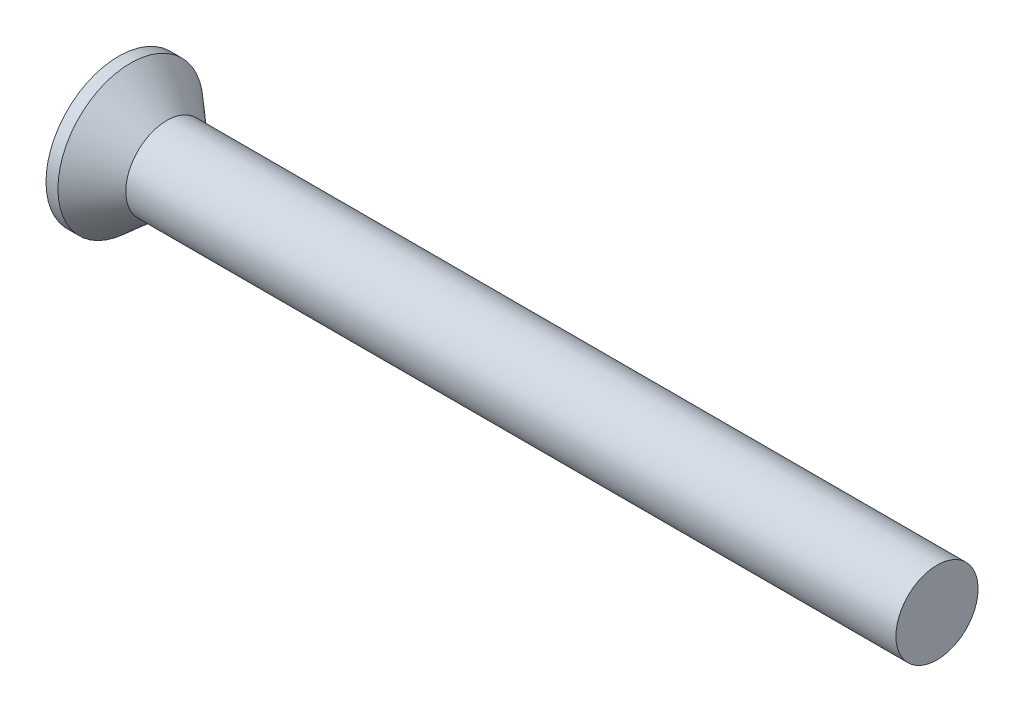
ISO-10303-21;
HEADER;
FILE_DESCRIPTION(('STEP AP214'),'2;1');
FILE_NAME('part.step','',(''),(''),'','','');
FILE_SCHEMA(('AUTOMOTIVE_DESIGN { 1 0 10303 214 1 1 1 1 }'));
ENDSEC;
DATA;
#1=APPLICATION_CONTEXT('core data for automotive mechanical design processes');
#2=APPLICATION_PROTOCOL_DEFINITION('international standard','automotive_design',2000,#1);
#3=PRODUCT_CONTEXT('',#1,'mechanical');
#4=PRODUCT('Part','Part','',(#3));
#5=PRODUCT_RELATED_PRODUCT_CATEGORY('part','',(#4));
#6=PRODUCT_DEFINITION_FORMATION('','',#4);
#7=PRODUCT_DEFINITION_CONTEXT('part definition',#1,'design');
#8=PRODUCT_DEFINITION('design','',#6,#7);
#9=PRODUCT_DEFINITION_SHAPE('','',#8);
#10=(LENGTH_UNIT() NAMED_UNIT(*) SI_UNIT(.MILLI.,.METRE.));
#11=(NAMED_UNIT(*) PLANE_ANGLE_UNIT() SI_UNIT($,.RADIAN.));
#12=(NAMED_UNIT(*) SI_UNIT($,.STERADIAN.) SOLID_ANGLE_UNIT());
#13=UNCERTAINTY_MEASURE_WITH_UNIT(LENGTH_MEASURE(1.E-05),#10,'distance_accuracy_value','');
#14=(GEOMETRIC_REPRESENTATION_CONTEXT(3) GLOBAL_UNCERTAINTY_ASSIGNED_CONTEXT((#13)) GLOBAL_UNIT_ASSIGNED_CONTEXT((#10,
#11,#12)) REPRESENTATION_CONTEXT('',''));
#15=CARTESIAN_POINT('',(0.,0.,0.));
#16=DIRECTION('',(0.,0.,1.));
#17=DIRECTION('',(1.,0.,0.));
#18=AXIS2_PLACEMENT_3D('',#15,#16,#17);
#19=CARTESIAN_POINT('',(0.,0.,0.));
#20=DIRECTION('',(-1.,0.,0.));
#21=DIRECTION('',(0.,0.,1.));
#22=AXIS2_PLACEMENT_3D('',#19,#20,#21);
#23=PLANE('',#22);
#24=CARTESIAN_POINT('',(0.,0.,0.));
#25=DIRECTION('',(-1.,0.,0.));
#26=DIRECTION('',(0.,0.,1.));
#27=AXIS2_PLACEMENT_3D('',#24,#25,#26);
#28=CIRCLE('',#27,3.0988);
#29=CARTESIAN_POINT('',(0.,0.,3.0988));
#30=VERTEX_POINT('',#29);
#31=EDGE_CURVE('E40',#30,#30,#28,.T.);
#32=ORIENTED_EDGE('',*,*,#31,.T.);
#33=EDGE_LOOP('',(#32));
#34=FACE_BOUND('',#33,.T.);
#35=DIRECTION('',(0.,1.,0.));
#36=VECTOR('',#35,1.);
#37=CARTESIAN_POINT('',(0.,-2.4765,-0.4826));
#38=LINE('',#37,#36);
#39=CARTESIAN_POINT('',(0.,-2.4765,-0.4826));
#40=VERTEX_POINT('',#39);
#41=CARTESIAN_POINT('',(0.,-0.482599999999998,-0.4826));
#42=VERTEX_POINT('',#41);
#43=EDGE_CURVE('E101',#40,#42,#38,.T.);
#44=ORIENTED_EDGE('',*,*,#43,.T.);
#45=DIRECTION('',(0.,0.,-1.));
#46=VECTOR('',#45,1.);
#47=CARTESIAN_POINT('',(0.,-0.482600000000008,2.4765));
#48=LINE('',#47,#46);
#49=CARTESIAN_POINT('',(0.,-0.482599999999992,-2.4765));
#50=VERTEX_POINT('',#49);
#51=EDGE_CURVE('E81',#42,#50,#48,.T.);
#52=ORIENTED_EDGE('',*,*,#51,.T.);
#53=DIRECTION('',(0.,1.,0.));
#54=VECTOR('',#53,1.);
#55=CARTESIAN_POINT('',(0.,-0.482599999999992,-2.4765));
#56=LINE('',#55,#54);
#57=CARTESIAN_POINT('',(0.,0.482600000000008,-2.4765));
#58=VERTEX_POINT('',#57);
#59=EDGE_CURVE('E336',#50,#58,#56,.T.);
#60=ORIENTED_EDGE('',*,*,#59,.T.);
#61=DIRECTION('',(0.,0.,1.));
#62=VECTOR('',#61,1.);
#63=CARTESIAN_POINT('',(0.,0.482600000000008,-2.4765));
#64=LINE('',#63,#62);
#65=CARTESIAN_POINT('',(0.,0.482600000000001,-0.4826));
#66=VERTEX_POINT('',#65);
#67=EDGE_CURVE('E97',#58,#66,#64,.T.);
#68=ORIENTED_EDGE('',*,*,#67,.T.);
#69=CARTESIAN_POINT('',(0.,2.4765,-0.4826));
#70=VERTEX_POINT('',#69);
#71=EDGE_CURVE('E91',#66,#70,#38,.T.);
#72=ORIENTED_EDGE('',*,*,#71,.T.);
#73=DIRECTION('',(0.,0.,1.));
#74=VECTOR('',#73,1.);
#75=CARTESIAN_POINT('',(0.,2.4765,-0.4826));
#76=LINE('',#75,#74);
#77=CARTESIAN_POINT('',(0.,2.4765,0.4826));
#78=VERTEX_POINT('',#77);
#79=EDGE_CURVE('E94',#70,#78,#76,.T.);
#80=ORIENTED_EDGE('',*,*,#79,.T.);
#81=DIRECTION('',(0.,-1.,0.));
#82=VECTOR('',#81,1.);
#83=CARTESIAN_POINT('',(0.,2.4765,0.4826));
#84=LINE('',#83,#82);
#85=CARTESIAN_POINT('',(0.,0.482599999999998,0.4826));
#86=VERTEX_POINT('',#85);
#87=EDGE_CURVE('E348',#78,#86,#84,.T.);
#88=ORIENTED_EDGE('',*,*,#87,.T.);
#89=CARTESIAN_POINT('',(0.,0.482599999999991,2.4765));
#90=VERTEX_POINT('',#89);
#91=EDGE_CURVE('E331',#86,#90,#64,.T.);
#92=ORIENTED_EDGE('',*,*,#91,.T.);
#93=DIRECTION('',(0.,-1.,0.));
#94=VECTOR('',#93,1.);
#95=CARTESIAN_POINT('',(0.,0.482599999999991,2.4765));
#96=LINE('',#95,#94);
#97=CARTESIAN_POINT('',(0.,-0.482600000000008,2.4765));
#98=VERTEX_POINT('',#97);
#99=EDGE_CURVE('E317',#90,#98,#96,.T.);
#100=ORIENTED_EDGE('',*,*,#99,.T.);
#101=CARTESIAN_POINT('',(0.,-0.482600000000002,0.4826));
#102=VERTEX_POINT('',#101);
#103=EDGE_CURVE('E329',#98,#102,#48,.T.);
#104=ORIENTED_EDGE('',*,*,#103,.T.);
#105=CARTESIAN_POINT('',(0.,-2.4765,0.4826));
#106=VERTEX_POINT('',#105);
#107=EDGE_CURVE('E107',#102,#106,#84,.T.);
#108=ORIENTED_EDGE('',*,*,#107,.T.);
#109=DIRECTION('',(0.,0.,-1.));
#110=VECTOR('',#109,1.);
#111=CARTESIAN_POINT('',(0.,-2.4765,0.4826));
#112=LINE('',#111,#110);
#113=EDGE_CURVE('E130',#106,#40,#112,.T.);
#114=ORIENTED_EDGE('',*,*,#113,.T.);
#115=EDGE_LOOP('',(#44,#52,#60,#68,#72,#80,#88,#92,#100,#104,#108,#114));
#116=FACE_BOUND('',#115,.T.);
#117=ADVANCED_FACE('F33',(#34,#116),#23,.T.);
#118=CARTESIAN_POINT('',(3.18005113636364,0.,0.215250568181818));
#119=DIRECTION('',(-0.0837752602144701,0.,-0.996484674130013));
#120=DIRECTION('',(-0.996484674130013,0.,0.0837752602144701));
#121=AXIS2_PLACEMENT_3D('',#118,#119,#120);
#122=PLANE('',#121);
#123=ORIENTED_EDGE('',*,*,#107,.F.);
#124=DIRECTION('',(0.993006162058238,0.0834828189341,-0.0834828189340997));
#125=VECTOR('',#124,1.);
#126=CARTESIAN_POINT('',(3.19789518323365,-0.213750404949385,0.213750404949384));
#127=LINE('',#126,#125);
#128=CARTESIAN_POINT('',(2.8702,-0.241300000000001,0.241299999999999));
#129=VERTEX_POINT('',#128);
#130=EDGE_CURVE('E125',#102,#129,#127,.T.);
#131=ORIENTED_EDGE('',*,*,#130,.T.);
#132=DIRECTION('',(0.78724620786628,0.613076692851616,-0.0661844157055722));
#133=VECTOR('',#132,1.);
#134=CARTESIAN_POINT('',(0.,-2.4765,0.4826));
#135=LINE('',#134,#133);
#136=EDGE_CURVE('E102',#106,#129,#135,.T.);
#137=ORIENTED_EDGE('',*,*,#136,.F.);
#138=EDGE_LOOP('',(#123,#131,#137));
#139=FACE_BOUND('',#138,.T.);
#140=ADVANCED_FACE('F153',(#139),#122,.T.);
#141=DIRECTION('',(0.78724620786628,-0.613076692851616,-0.0661844157055721));
#142=VECTOR('',#141,1.);
#143=CARTESIAN_POINT('',(0.,2.4765,0.4826));
#144=LINE('',#143,#142);
#145=CARTESIAN_POINT('',(2.8702,0.2413,0.2413));
#146=VERTEX_POINT('',#145);
#147=EDGE_CURVE('E47',#78,#146,#144,.T.);
#148=ORIENTED_EDGE('',*,*,#147,.T.);
#149=DIRECTION('',(-0.993006162058239,0.0834828189340993,0.0834828189340997));
#150=VECTOR('',#149,1.);
#151=CARTESIAN_POINT('',(3.19789518323365,0.213750404949383,0.213750404949384));
#152=LINE('',#151,#150);
#153=EDGE_CURVE('E344',#146,#86,#152,.T.);
#154=ORIENTED_EDGE('',*,*,#153,.T.);
#155=ORIENTED_EDGE('',*,*,#87,.F.);
#156=EDGE_LOOP('',(#148,#154,#155));
#157=FACE_BOUND('',#156,.T.);
#158=ADVANCED_FACE('F157',(#157),#122,.T.);
#159=CARTESIAN_POINT('',(3.18005113636364,0.,-0.215250568181818));
#160=DIRECTION('',(-0.08377526021447,0.,0.996484674130013));
#161=DIRECTION('',(0.996484674130013,0.,0.08377526021447));
#162=AXIS2_PLACEMENT_3D('',#159,#160,#161);
#163=PLANE('',#162);
#164=DIRECTION('',(0.78724620786628,0.613076692851616,0.0661844157055721));
#165=VECTOR('',#164,1.);
#166=CARTESIAN_POINT('',(0.,-2.4765,-0.4826));
#167=LINE('',#166,#165);
#168=CARTESIAN_POINT('',(2.8702,-0.241299999999999,-0.241300000000001));
#169=VERTEX_POINT('',#168);
#170=EDGE_CURVE('E56',#40,#169,#167,.T.);
#171=ORIENTED_EDGE('',*,*,#170,.T.);
#172=DIRECTION('',(-0.993006162058239,-0.0834828189340994,-0.0834828189340996));
#173=VECTOR('',#172,1.);
#174=CARTESIAN_POINT('',(3.19789518323364,-0.213750404949383,-0.213750404949384));
#175=LINE('',#174,#173);
#176=EDGE_CURVE('E11',#169,#42,#175,.T.);
#177=ORIENTED_EDGE('',*,*,#176,.T.);
#178=ORIENTED_EDGE('',*,*,#43,.F.);
#179=EDGE_LOOP('',(#171,#177,#178));
#180=FACE_BOUND('',#179,.T.);
#181=ADVANCED_FACE('F150',(#180),#163,.T.);
#182=ORIENTED_EDGE('',*,*,#71,.F.);
#183=DIRECTION('',(0.993006162058238,-0.0834828189340999,0.0834828189340996));
#184=VECTOR('',#183,1.);
#185=CARTESIAN_POINT('',(3.19789518323364,0.213750404949385,-0.213750404949384));
#186=LINE('',#185,#184);
#187=CARTESIAN_POINT('',(2.8702,0.2413,-0.2413));
#188=VERTEX_POINT('',#187);
#189=EDGE_CURVE('E110',#66,#188,#186,.T.);
#190=ORIENTED_EDGE('',*,*,#189,.T.);
#191=DIRECTION('',(0.78724620786628,-0.613076692851616,0.0661844157055721));
#192=VECTOR('',#191,1.);
#193=CARTESIAN_POINT('',(0.,2.4765,-0.4826));
#194=LINE('',#193,#192);
#195=EDGE_CURVE('E106',#70,#188,#194,.T.);
#196=ORIENTED_EDGE('',*,*,#195,.F.);
#197=EDGE_LOOP('',(#182,#190,#196));
#198=FACE_BOUND('',#197,.T.);
#199=ADVANCED_FACE('F109',(#198),#163,.T.);
#200=CARTESIAN_POINT('',(-6.34999999999999,0.,0.));
#201=DIRECTION('',(-1.,0.,0.));
#202=DIRECTION('',(0.,0.,1.));
#203=AXIS2_PLACEMENT_3D('',#200,#201,#202);
#204=CYLINDRICAL_SURFACE('',#203,3.0988);
#205=CARTESIAN_POINT('',(0.508774050199084,0.,0.));
#206=DIRECTION('',(-1.,0.,0.));
#207=DIRECTION('',(0.,0.,1.));
#208=AXIS2_PLACEMENT_3D('',#205,#206,#207);
#209=CIRCLE('',#208,3.0988);
#210=CARTESIAN_POINT('',(0.508774050199084,0.,3.0988));
#211=VERTEX_POINT('',#210);
#212=EDGE_CURVE('E133',#211,#211,#209,.T.);
#213=ORIENTED_EDGE('',*,*,#212,.T.);
#214=EDGE_LOOP('',(#213));
#215=FACE_BOUND('',#214,.T.);
#216=ORIENTED_EDGE('',*,*,#31,.F.);
#217=EDGE_LOOP('',(#216));
#218=FACE_BOUND('',#217,.T.);
#219=ADVANCED_FACE('F139',(#215,#218),#204,.T.);
#220=CARTESIAN_POINT('',(0.508774050199084,0.,0.));
#221=DIRECTION('',(-1.,0.,0.));
#222=DIRECTION('',(0.,0.,1.));
#223=AXIS2_PLACEMENT_3D('',#220,#221,#222);
#224=CONICAL_SURFACE('',#223,3.0988,0.715584993317677);
#225=CARTESIAN_POINT('',(2.0574,0.,0.));
#226=DIRECTION('',(-1.,0.,0.));
#227=DIRECTION('',(0.,0.,1.));
#228=AXIS2_PLACEMENT_3D('',#225,#226,#227);
#229=CIRCLE('',#228,1.7526);
#230=CARTESIAN_POINT('',(2.0574,0.,1.7526));
#231=VERTEX_POINT('',#230);
#232=EDGE_CURVE('E129',#231,#231,#229,.T.);
#233=ORIENTED_EDGE('',*,*,#232,.T.);
#234=EDGE_LOOP('',(#233));
#235=FACE_BOUND('',#234,.T.);
#236=ORIENTED_EDGE('',*,*,#212,.F.);
#237=EDGE_LOOP('',(#236));
#238=FACE_BOUND('',#237,.T.);
#239=ADVANCED_FACE('F141',(#235,#238),#224,.T.);
#240=CARTESIAN_POINT('',(-6.34999999999999,0.,0.));
#241=DIRECTION('',(-1.,0.,0.));
#242=DIRECTION('',(0.,0.,1.));
#243=AXIS2_PLACEMENT_3D('',#240,#241,#242);
#244=CYLINDRICAL_SURFACE('',#243,1.7526);
#245=CARTESIAN_POINT('',(34.925,0.,0.));
#246=DIRECTION('',(-1.,0.,0.));
#247=DIRECTION('',(0.,0.,1.));
#248=AXIS2_PLACEMENT_3D('',#245,#246,#247);
#249=CIRCLE('',#248,1.7526);
#250=CARTESIAN_POINT('',(34.925,0.,1.7526));
#251=VERTEX_POINT('',#250);
#252=EDGE_CURVE('E126',#251,#251,#249,.T.);
#253=ORIENTED_EDGE('',*,*,#252,.T.);
#254=EDGE_LOOP('',(#253));
#255=FACE_BOUND('',#254,.T.);
#256=ORIENTED_EDGE('',*,*,#232,.F.);
#257=EDGE_LOOP('',(#256));
#258=FACE_BOUND('',#257,.T.);
#259=ADVANCED_FACE('F147',(#255,#258),#244,.T.);
#260=CARTESIAN_POINT('',(34.925,1.7526,0.));
#261=DIRECTION('',(1.,0.,0.));
#262=DIRECTION('',(0.,0.,-1.));
#263=AXIS2_PLACEMENT_3D('',#260,#261,#262);
#264=PLANE('',#263);
#265=ORIENTED_EDGE('',*,*,#252,.F.);
#266=EDGE_LOOP('',(#265));
#267=FACE_BOUND('',#266,.T.);
#268=ADVANCED_FACE('F177',(#267),#264,.T.);
#269=CARTESIAN_POINT('',(2.8702,0.2413,-0.2413));
#270=DIRECTION('',(1.,0.,0.));
#271=DIRECTION('',(0.,0.,-1.));
#272=AXIS2_PLACEMENT_3D('',#269,#270,#271);
#273=PLANE('',#272);
#274=DIRECTION('',(0.,1.,0.));
#275=VECTOR('',#274,1.);
#276=CARTESIAN_POINT('',(2.8702,-0.2413,-0.2413));
#277=LINE('',#276,#275);
#278=EDGE_CURVE('E121',#169,#188,#277,.T.);
#279=ORIENTED_EDGE('',*,*,#278,.F.);
#280=DIRECTION('',(0.,0.,-1.));
#281=VECTOR('',#280,1.);
#282=CARTESIAN_POINT('',(2.8702,-0.2413,0.2413));
#283=LINE('',#282,#281);
#284=EDGE_CURVE('E112',#129,#169,#283,.T.);
#285=ORIENTED_EDGE('',*,*,#284,.F.);
#286=DIRECTION('',(0.,-1.,0.));
#287=VECTOR('',#286,1.);
#288=CARTESIAN_POINT('',(2.8702,0.2413,0.2413));
#289=LINE('',#288,#287);
#290=EDGE_CURVE('E115',#146,#129,#289,.T.);
#291=ORIENTED_EDGE('',*,*,#290,.F.);
#292=DIRECTION('',(0.,0.,1.));
#293=VECTOR('',#292,1.);
#294=CARTESIAN_POINT('',(2.8702,0.2413,-0.2413));
#295=LINE('',#294,#293);
#296=EDGE_CURVE('E119',#188,#146,#295,.T.);
#297=ORIENTED_EDGE('',*,*,#296,.F.);
#298=EDGE_LOOP('',(#279,#285,#291,#297));
#299=FACE_BOUND('',#298,.T.);
#300=ADVANCED_FACE('F174',(#299),#273,.F.);
#301=CARTESIAN_POINT('',(0.,-2.4765,-0.4826));
#302=DIRECTION('',(-0.614423873827266,0.788976110710012,0.));
#303=DIRECTION('',(-0.788976110710012,-0.614423873827266,0.));
#304=AXIS2_PLACEMENT_3D('',#301,#302,#303);
#305=PLANE('',#304);
#306=ORIENTED_EDGE('',*,*,#170,.F.);
#307=ORIENTED_EDGE('',*,*,#113,.F.);
#308=ORIENTED_EDGE('',*,*,#136,.T.);
#309=ORIENTED_EDGE('',*,*,#284,.T.);
#310=EDGE_LOOP('',(#306,#307,#308,#309));
#311=FACE_BOUND('',#310,.T.);
#312=ADVANCED_FACE('F166',(#311),#305,.T.);
#313=CARTESIAN_POINT('',(2.8702,0.2413,0.2413));
#314=DIRECTION('',(-0.614423873827266,-0.788976110710012,0.));
#315=DIRECTION('',(0.788976110710012,-0.614423873827266,0.));
#316=AXIS2_PLACEMENT_3D('',#313,#314,#315);
#317=PLANE('',#316);
#318=ORIENTED_EDGE('',*,*,#147,.F.);
#319=ORIENTED_EDGE('',*,*,#79,.F.);
#320=ORIENTED_EDGE('',*,*,#195,.T.);
#321=ORIENTED_EDGE('',*,*,#296,.T.);
#322=EDGE_LOOP('',(#318,#319,#320,#321));
#323=FACE_BOUND('',#322,.T.);
#324=ADVANCED_FACE('F105',(#323),#317,.T.);
#325=CARTESIAN_POINT('',(3.18005113636364,-0.215250568181818,0.));
#326=DIRECTION('',(-0.0837752602144701,0.996484674130013,0.));
#327=DIRECTION('',(-0.996484674130013,-0.0837752602144701,0.));
#328=AXIS2_PLACEMENT_3D('',#325,#326,#327);
#329=PLANE('',#328);
#330=DIRECTION('',(0.78724620786628,0.0661844157055701,0.613076692851616));
#331=VECTOR('',#330,1.);
#332=CARTESIAN_POINT('',(0.,-0.482599999999992,-2.4765));
#333=LINE('',#332,#331);
#334=EDGE_CURVE('E338',#50,#169,#333,.T.);
#335=ORIENTED_EDGE('',*,*,#334,.F.);
#336=ORIENTED_EDGE('',*,*,#51,.F.);
#337=ORIENTED_EDGE('',*,*,#176,.F.);
#338=EDGE_LOOP('',(#335,#336,#337));
#339=FACE_BOUND('',#338,.T.);
#340=ADVANCED_FACE('F173',(#339),#329,.T.);
#341=CARTESIAN_POINT('',(3.18005113636364,0.215250568181818,0.));
#342=DIRECTION('',(-0.08377526021447,-0.996484674130013,0.));
#343=DIRECTION('',(0.996484674130013,-0.08377526021447,0.));
#344=AXIS2_PLACEMENT_3D('',#341,#342,#343);
#345=PLANE('',#344);
#346=ORIENTED_EDGE('',*,*,#67,.F.);
#347=DIRECTION('',(0.78724620786628,-0.0661844157055742,0.613076692851616));
#348=VECTOR('',#347,1.);
#349=CARTESIAN_POINT('',(0.,0.482600000000008,-2.4765));
#350=LINE('',#349,#348);
#351=EDGE_CURVE('E72',#58,#188,#350,.T.);
#352=ORIENTED_EDGE('',*,*,#351,.T.);
#353=ORIENTED_EDGE('',*,*,#189,.F.);
#354=EDGE_LOOP('',(#346,#352,#353));
#355=FACE_BOUND('',#354,.T.);
#356=ADVANCED_FACE('F217',(#355),#345,.T.);
#357=CARTESIAN_POINT('',(0.,0.482600000000008,-2.4765));
#358=DIRECTION('',(-0.614423873827266,0.,0.788976110710012));
#359=DIRECTION('',(-0.788976110710012,0.,-0.614423873827266));
#360=AXIS2_PLACEMENT_3D('',#357,#358,#359);
#361=PLANE('',#360);
#362=ORIENTED_EDGE('',*,*,#351,.F.);
#363=ORIENTED_EDGE('',*,*,#59,.F.);
#364=ORIENTED_EDGE('',*,*,#334,.T.);
#365=ORIENTED_EDGE('',*,*,#278,.T.);
#366=EDGE_LOOP('',(#362,#363,#364,#365));
#367=FACE_BOUND('',#366,.T.);
#368=ADVANCED_FACE('F225',(#367),#361,.T.);
#369=ORIENTED_EDGE('',*,*,#103,.F.);
#370=DIRECTION('',(0.78724620786628,0.0661844157055742,-0.613076692851616));
#371=VECTOR('',#370,1.);
#372=CARTESIAN_POINT('',(0.,-0.482600000000008,2.4765));
#373=LINE('',#372,#371);
#374=EDGE_CURVE('E314',#98,#129,#373,.T.);
#375=ORIENTED_EDGE('',*,*,#374,.T.);
#376=ORIENTED_EDGE('',*,*,#130,.F.);
#377=EDGE_LOOP('',(#369,#375,#376));
#378=FACE_BOUND('',#377,.T.);
#379=ADVANCED_FACE('F219',(#378),#329,.T.);
#380=DIRECTION('',(0.78724620786628,-0.06618441570557,-0.613076692851616));
#381=VECTOR('',#380,1.);
#382=CARTESIAN_POINT('',(0.,0.482599999999991,2.4765));
#383=LINE('',#382,#381);
#384=EDGE_CURVE('E325',#90,#146,#383,.T.);
#385=ORIENTED_EDGE('',*,*,#384,.F.);
#386=ORIENTED_EDGE('',*,*,#91,.F.);
#387=ORIENTED_EDGE('',*,*,#153,.F.);
#388=EDGE_LOOP('',(#385,#386,#387));
#389=FACE_BOUND('',#388,.T.);
#390=ADVANCED_FACE('F227',(#389),#345,.T.);
#391=CARTESIAN_POINT('',(2.8702,-0.241300000000001,0.241299999999999));
#392=DIRECTION('',(-0.614423873827266,0.,-0.788976110710012));
#393=DIRECTION('',(0.788976110710012,0.,-0.614423873827266));
#394=AXIS2_PLACEMENT_3D('',#391,#392,#393);
#395=PLANE('',#394);
#396=ORIENTED_EDGE('',*,*,#374,.F.);
#397=ORIENTED_EDGE('',*,*,#99,.F.);
#398=ORIENTED_EDGE('',*,*,#384,.T.);
#399=ORIENTED_EDGE('',*,*,#290,.T.);
#400=EDGE_LOOP('',(#396,#397,#398,#399));
#401=FACE_BOUND('',#400,.T.);
#402=ADVANCED_FACE('F246',(#401),#395,.T.);
#403=CLOSED_SHELL('',(#117,#140,#158,#181,#199,#219,#239,#259,#268,#300,#312,#324,#340,#356,
#368,#379,#390,#402));
#404=MANIFOLD_SOLID_BREP('B2',#403);
#405=ADVANCED_BREP_SHAPE_REPRESENTATION('',(#18,#404),#14);
#406=SHAPE_DEFINITION_REPRESENTATION(#9,#405);
ENDSEC;
END-ISO-10303-21;
